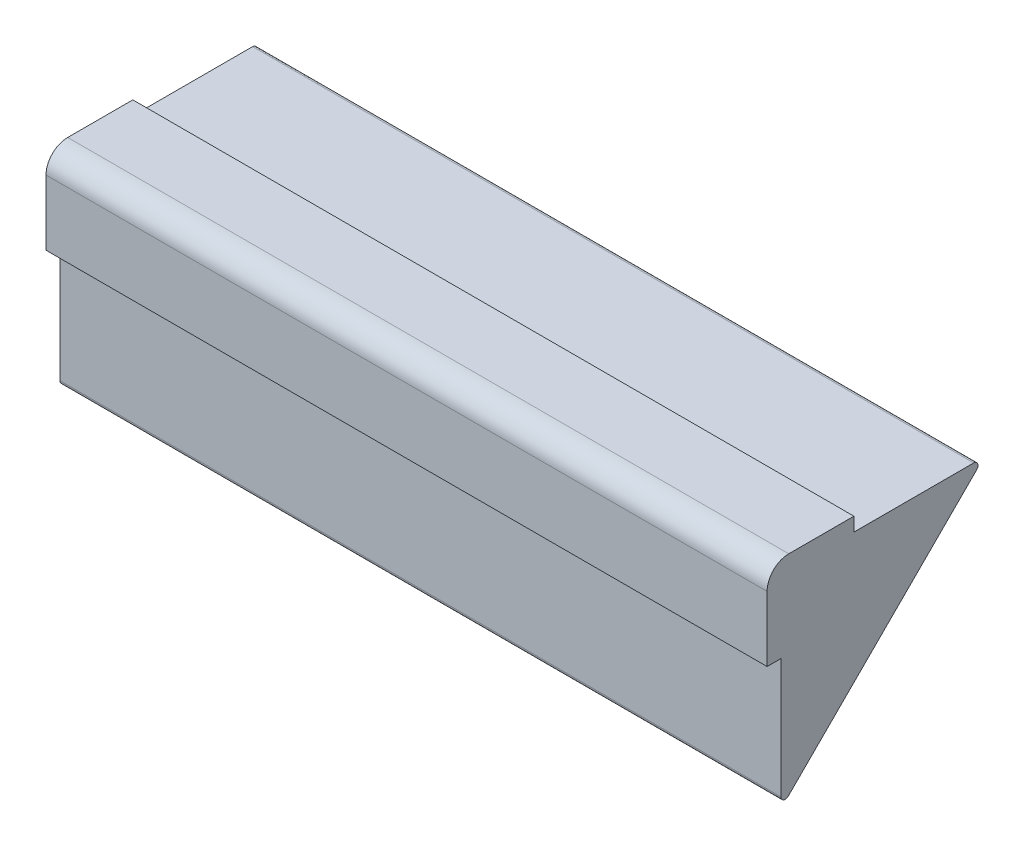
ISO-10303-21;
HEADER;
FILE_DESCRIPTION(('STEP AP214'),'2;1');
FILE_NAME('part.step','',(''),(''),'','','');
FILE_SCHEMA(('AUTOMOTIVE_DESIGN { 1 0 10303 214 1 1 1 1 }'));
ENDSEC;
DATA;
#1=APPLICATION_CONTEXT('core data for automotive mechanical design processes');
#2=APPLICATION_PROTOCOL_DEFINITION('international standard','automotive_design',2000,#1);
#3=PRODUCT_CONTEXT('',#1,'mechanical');
#4=PRODUCT('Part','Part','',(#3));
#5=PRODUCT_RELATED_PRODUCT_CATEGORY('part','',(#4));
#6=PRODUCT_DEFINITION_FORMATION('','',#4);
#7=PRODUCT_DEFINITION_CONTEXT('part definition',#1,'design');
#8=PRODUCT_DEFINITION('design','',#6,#7);
#9=PRODUCT_DEFINITION_SHAPE('','',#8);
#10=(LENGTH_UNIT() NAMED_UNIT(*) SI_UNIT(.MILLI.,.METRE.));
#11=(NAMED_UNIT(*) PLANE_ANGLE_UNIT() SI_UNIT($,.RADIAN.));
#12=(NAMED_UNIT(*) SI_UNIT($,.STERADIAN.) SOLID_ANGLE_UNIT());
#13=UNCERTAINTY_MEASURE_WITH_UNIT(LENGTH_MEASURE(1.E-05),#10,'distance_accuracy_value','');
#14=(GEOMETRIC_REPRESENTATION_CONTEXT(3) GLOBAL_UNCERTAINTY_ASSIGNED_CONTEXT((#13)) GLOBAL_UNIT_ASSIGNED_CONTEXT((#10,
#11,#12)) REPRESENTATION_CONTEXT('',''));
#15=CARTESIAN_POINT('',(0.,0.,0.));
#16=DIRECTION('',(0.,0.,1.));
#17=DIRECTION('',(1.,0.,0.));
#18=AXIS2_PLACEMENT_3D('',#15,#16,#17);
#19=CARTESIAN_POINT('',(166.124,-5.,-5.));
#20=DIRECTION('',(-1.,0.,0.));
#21=DIRECTION('',(0.,0.,1.));
#22=AXIS2_PLACEMENT_3D('',#19,#20,#21);
#23=CYLINDRICAL_SURFACE('',#22,5.);
#24=CARTESIAN_POINT('',(0.,-5.,-5.));
#25=DIRECTION('',(-1.,0.,0.));
#26=DIRECTION('',(0.,0.,1.));
#27=AXIS2_PLACEMENT_3D('',#24,#25,#26);
#28=CIRCLE('',#27,5.);
#29=CARTESIAN_POINT('',(0.,-5.00000000000004,0.));
#30=VERTEX_POINT('',#29);
#31=CARTESIAN_POINT('',(0.,0.,-5.00000000000004));
#32=VERTEX_POINT('',#31);
#33=EDGE_CURVE('E145',#30,#32,#28,.T.);
#34=ORIENTED_EDGE('',*,*,#33,.F.);
#35=DIRECTION('',(-1.,0.,0.));
#36=VECTOR('',#35,1.);
#37=CARTESIAN_POINT('',(166.124,-5.00000000000004,0.));
#38=LINE('',#37,#36);
#39=CARTESIAN_POINT('',(166.124,-5.00000000000004,0.));
#40=VERTEX_POINT('',#39);
#41=EDGE_CURVE('E11',#40,#30,#38,.T.);
#42=ORIENTED_EDGE('',*,*,#41,.F.);
#43=CARTESIAN_POINT('',(166.124,-5.,-5.));
#44=DIRECTION('',(-1.,0.,0.));
#45=DIRECTION('',(0.,0.,1.));
#46=AXIS2_PLACEMENT_3D('',#43,#44,#45);
#47=CIRCLE('',#46,5.);
#48=CARTESIAN_POINT('',(166.124,0.,-5.00000000000004));
#49=VERTEX_POINT('',#48);
#50=EDGE_CURVE('E171',#40,#49,#47,.T.);
#51=ORIENTED_EDGE('',*,*,#50,.T.);
#52=DIRECTION('',(-1.,0.,0.));
#53=VECTOR('',#52,1.);
#54=CARTESIAN_POINT('',(166.124,0.,-5.00000000000004));
#55=LINE('',#54,#53);
#56=EDGE_CURVE('E39',#49,#32,#55,.T.);
#57=ORIENTED_EDGE('',*,*,#56,.T.);
#58=EDGE_LOOP('',(#34,#42,#51,#57));
#59=FACE_BOUND('',#58,.T.);
#60=ADVANCED_FACE('F36',(#59),#23,.T.);
#61=CARTESIAN_POINT('',(166.124,-20.,0.));
#62=DIRECTION('',(0.,0.,1.));
#63=DIRECTION('',(0.,-1.,0.));
#64=AXIS2_PLACEMENT_3D('',#61,#62,#63);
#65=PLANE('',#64);
#66=DIRECTION('',(0.,1.,0.));
#67=VECTOR('',#66,1.);
#68=CARTESIAN_POINT('',(0.,-20.,0.));
#69=LINE('',#68,#67);
#70=CARTESIAN_POINT('',(0.,-20.,0.));
#71=VERTEX_POINT('',#70);
#72=EDGE_CURVE('E169',#71,#30,#69,.T.);
#73=ORIENTED_EDGE('',*,*,#72,.F.);
#74=DIRECTION('',(-1.,0.,0.));
#75=VECTOR('',#74,1.);
#76=CARTESIAN_POINT('',(166.124,-20.,0.));
#77=LINE('',#76,#75);
#78=CARTESIAN_POINT('',(166.124,-20.,0.));
#79=VERTEX_POINT('',#78);
#80=EDGE_CURVE('E45',#79,#71,#77,.T.);
#81=ORIENTED_EDGE('',*,*,#80,.F.);
#82=DIRECTION('',(0.,1.,0.));
#83=VECTOR('',#82,1.);
#84=CARTESIAN_POINT('',(166.124,-20.,0.));
#85=LINE('',#84,#83);
#86=EDGE_CURVE('E135',#79,#40,#85,.T.);
#87=ORIENTED_EDGE('',*,*,#86,.T.);
#88=ORIENTED_EDGE('',*,*,#41,.T.);
#89=EDGE_LOOP('',(#73,#81,#87,#88));
#90=FACE_BOUND('',#89,.T.);
#91=ADVANCED_FACE('F187',(#90),#65,.T.);
#92=CARTESIAN_POINT('',(166.124,-20.,-3.175));
#93=DIRECTION('',(0.,-1.,0.));
#94=DIRECTION('',(0.,0.,-1.));
#95=AXIS2_PLACEMENT_3D('',#92,#93,#94);
#96=PLANE('',#95);
#97=DIRECTION('',(0.,0.,1.));
#98=VECTOR('',#97,1.);
#99=CARTESIAN_POINT('',(0.,-20.,-3.175));
#100=LINE('',#99,#98);
#101=CARTESIAN_POINT('',(0.,-20.,-3.175));
#102=VERTEX_POINT('',#101);
#103=EDGE_CURVE('E122',#102,#71,#100,.T.);
#104=ORIENTED_EDGE('',*,*,#103,.F.);
#105=DIRECTION('',(-1.,0.,0.));
#106=VECTOR('',#105,1.);
#107=CARTESIAN_POINT('',(166.124,-20.,-3.175));
#108=LINE('',#107,#106);
#109=CARTESIAN_POINT('',(166.124,-20.,-3.175));
#110=VERTEX_POINT('',#109);
#111=EDGE_CURVE('E117',#110,#102,#108,.T.);
#112=ORIENTED_EDGE('',*,*,#111,.F.);
#113=DIRECTION('',(0.,0.,1.));
#114=VECTOR('',#113,1.);
#115=CARTESIAN_POINT('',(166.124,-20.,-3.175));
#116=LINE('',#115,#114);
#117=EDGE_CURVE('E120',#110,#79,#116,.T.);
#118=ORIENTED_EDGE('',*,*,#117,.T.);
#119=ORIENTED_EDGE('',*,*,#80,.T.);
#120=EDGE_LOOP('',(#104,#112,#118,#119));
#121=FACE_BOUND('',#120,.T.);
#122=ADVANCED_FACE('F119',(#121),#96,.T.);
#123=CARTESIAN_POINT('',(166.124,-47.5857864376269,-3.17500000000001));
#124=DIRECTION('',(0.,0.,1.));
#125=DIRECTION('',(0.,-1.,0.));
#126=AXIS2_PLACEMENT_3D('',#123,#124,#125);
#127=PLANE('',#126);
#128=DIRECTION('',(0.,1.,0.));
#129=VECTOR('',#128,1.);
#130=CARTESIAN_POINT('',(0.,-47.5857864376269,-3.17500000000001));
#131=LINE('',#130,#129);
#132=CARTESIAN_POINT('',(0.,-47.5857864376269,-3.17500000000001));
#133=VERTEX_POINT('',#132);
#134=EDGE_CURVE('E166',#133,#102,#131,.T.);
#135=ORIENTED_EDGE('',*,*,#134,.F.);
#136=DIRECTION('',(-1.,0.,0.));
#137=VECTOR('',#136,1.);
#138=CARTESIAN_POINT('',(166.124,-47.5857864376269,-3.17500000000001));
#139=LINE('',#138,#137);
#140=CARTESIAN_POINT('',(166.124,-47.5857864376269,-3.17500000000001));
#141=VERTEX_POINT('',#140);
#142=EDGE_CURVE('E127',#141,#133,#139,.T.);
#143=ORIENTED_EDGE('',*,*,#142,.F.);
#144=DIRECTION('',(0.,1.,0.));
#145=VECTOR('',#144,1.);
#146=CARTESIAN_POINT('',(166.124,-47.5857864376269,-3.17500000000001));
#147=LINE('',#146,#145);
#148=EDGE_CURVE('E133',#141,#110,#147,.T.);
#149=ORIENTED_EDGE('',*,*,#148,.T.);
#150=ORIENTED_EDGE('',*,*,#111,.T.);
#151=EDGE_LOOP('',(#135,#143,#149,#150));
#152=FACE_BOUND('',#151,.T.);
#153=ADVANCED_FACE('F137',(#152),#127,.T.);
#154=CARTESIAN_POINT('',(166.124,-47.5857864376269,-4.17500000000001));
#155=DIRECTION('',(-1.,0.,0.));
#156=DIRECTION('',(0.,0.,1.));
#157=AXIS2_PLACEMENT_3D('',#154,#155,#156);
#158=CYLINDRICAL_SURFACE('',#157,1.);
#159=CARTESIAN_POINT('',(0.,-47.5857864376269,-4.17500000000001));
#160=DIRECTION('',(-1.,0.,0.));
#161=DIRECTION('',(0.,0.,1.));
#162=AXIS2_PLACEMENT_3D('',#159,#160,#161);
#163=CIRCLE('',#162,1.);
#164=CARTESIAN_POINT('',(0.,-48.2928932188134,-4.88210678118657));
#165=VERTEX_POINT('',#164);
#166=EDGE_CURVE('E163',#165,#133,#163,.T.);
#167=ORIENTED_EDGE('',*,*,#166,.F.);
#168=DIRECTION('',(-1.,0.,0.));
#169=VECTOR('',#168,1.);
#170=CARTESIAN_POINT('',(166.124,-48.2928932188134,-4.88210678118657));
#171=LINE('',#170,#169);
#172=CARTESIAN_POINT('',(166.124,-48.2928932188134,-4.88210678118657));
#173=VERTEX_POINT('',#172);
#174=EDGE_CURVE('E175',#173,#165,#171,.T.);
#175=ORIENTED_EDGE('',*,*,#174,.F.);
#176=CARTESIAN_POINT('',(166.124,-47.5857864376269,-4.17500000000001));
#177=DIRECTION('',(-1.,0.,0.));
#178=DIRECTION('',(0.,0.,1.));
#179=AXIS2_PLACEMENT_3D('',#176,#177,#178);
#180=CIRCLE('',#179,1.);
#181=EDGE_CURVE('E138',#173,#141,#180,.T.);
#182=ORIENTED_EDGE('',*,*,#181,.T.);
#183=ORIENTED_EDGE('',*,*,#142,.T.);
#184=EDGE_LOOP('',(#167,#175,#182,#183));
#185=FACE_BOUND('',#184,.T.);
#186=ADVANCED_FACE('F200',(#185),#158,.T.);
#187=CARTESIAN_POINT('',(166.124,-4.88210678118656,-48.2928932188134));
#188=DIRECTION('',(0.,-0.707106781186547,-0.707106781186548));
#189=DIRECTION('',(0.,0.707106781186548,-0.707106781186547));
#190=AXIS2_PLACEMENT_3D('',#187,#188,#189);
#191=PLANE('',#190);
#192=DIRECTION('',(0.,-0.707106781186548,0.707106781186547));
#193=VECTOR('',#192,1.);
#194=CARTESIAN_POINT('',(0.,-4.88210678118656,-48.2928932188134));
#195=LINE('',#194,#193);
#196=CARTESIAN_POINT('',(0.,-4.88210678118656,-48.2928932188134));
#197=VERTEX_POINT('',#196);
#198=EDGE_CURVE('E160',#197,#165,#195,.T.);
#199=ORIENTED_EDGE('',*,*,#198,.F.);
#200=DIRECTION('',(-1.,0.,0.));
#201=VECTOR('',#200,1.);
#202=CARTESIAN_POINT('',(166.124,-4.88210678118656,-48.2928932188134));
#203=LINE('',#202,#201);
#204=CARTESIAN_POINT('',(166.124,-4.88210678118656,-48.2928932188134));
#205=VERTEX_POINT('',#204);
#206=EDGE_CURVE('E177',#205,#197,#203,.T.);
#207=ORIENTED_EDGE('',*,*,#206,.F.);
#208=DIRECTION('',(0.,-0.707106781186548,0.707106781186547));
#209=VECTOR('',#208,1.);
#210=CARTESIAN_POINT('',(166.124,-4.88210678118656,-48.2928932188134));
#211=LINE('',#210,#209);
#212=EDGE_CURVE('E140',#205,#173,#211,.T.);
#213=ORIENTED_EDGE('',*,*,#212,.T.);
#214=ORIENTED_EDGE('',*,*,#174,.T.);
#215=EDGE_LOOP('',(#199,#207,#213,#214));
#216=FACE_BOUND('',#215,.T.);
#217=ADVANCED_FACE('F203',(#216),#191,.T.);
#218=CARTESIAN_POINT('',(166.124,-4.175,-47.5857864376269));
#219=DIRECTION('',(-1.,0.,0.));
#220=DIRECTION('',(0.,0.,1.));
#221=AXIS2_PLACEMENT_3D('',#218,#219,#220);
#222=CYLINDRICAL_SURFACE('',#221,1.);
#223=CARTESIAN_POINT('',(0.,-4.175,-47.5857864376269));
#224=DIRECTION('',(-1.,0.,0.));
#225=DIRECTION('',(0.,0.,1.));
#226=AXIS2_PLACEMENT_3D('',#223,#224,#225);
#227=CIRCLE('',#226,1.);
#228=CARTESIAN_POINT('',(0.,-3.175,-47.5857864376269));
#229=VERTEX_POINT('',#228);
#230=EDGE_CURVE('E157',#229,#197,#227,.T.);
#231=ORIENTED_EDGE('',*,*,#230,.F.);
#232=DIRECTION('',(-1.,0.,0.));
#233=VECTOR('',#232,1.);
#234=CARTESIAN_POINT('',(166.124,-3.175,-47.5857864376269));
#235=LINE('',#234,#233);
#236=CARTESIAN_POINT('',(166.124,-3.175,-47.5857864376269));
#237=VERTEX_POINT('',#236);
#238=EDGE_CURVE('E179',#237,#229,#235,.T.);
#239=ORIENTED_EDGE('',*,*,#238,.F.);
#240=CARTESIAN_POINT('',(166.124,-4.175,-47.5857864376269));
#241=DIRECTION('',(-1.,0.,0.));
#242=DIRECTION('',(0.,0.,1.));
#243=AXIS2_PLACEMENT_3D('',#240,#241,#242);
#244=CIRCLE('',#243,1.);
#245=EDGE_CURVE('E302',#237,#205,#244,.T.);
#246=ORIENTED_EDGE('',*,*,#245,.T.);
#247=ORIENTED_EDGE('',*,*,#206,.T.);
#248=EDGE_LOOP('',(#231,#239,#246,#247));
#249=FACE_BOUND('',#248,.T.);
#250=ADVANCED_FACE('F207',(#249),#222,.T.);
#251=CARTESIAN_POINT('',(166.124,-3.175,-20.));
#252=DIRECTION('',(0.,1.,0.));
#253=DIRECTION('',(0.,0.,1.));
#254=AXIS2_PLACEMENT_3D('',#251,#252,#253);
#255=PLANE('',#254);
#256=DIRECTION('',(0.,0.,-1.));
#257=VECTOR('',#256,1.);
#258=CARTESIAN_POINT('',(0.,-3.175,-20.));
#259=LINE('',#258,#257);
#260=CARTESIAN_POINT('',(0.,-3.175,-20.));
#261=VERTEX_POINT('',#260);
#262=EDGE_CURVE('E154',#261,#229,#259,.T.);
#263=ORIENTED_EDGE('',*,*,#262,.F.);
#264=DIRECTION('',(-1.,0.,0.));
#265=VECTOR('',#264,1.);
#266=CARTESIAN_POINT('',(166.124,-3.175,-20.));
#267=LINE('',#266,#265);
#268=CARTESIAN_POINT('',(166.124,-3.175,-20.));
#269=VERTEX_POINT('',#268);
#270=EDGE_CURVE('E181',#269,#261,#267,.T.);
#271=ORIENTED_EDGE('',*,*,#270,.F.);
#272=DIRECTION('',(0.,0.,-1.));
#273=VECTOR('',#272,1.);
#274=CARTESIAN_POINT('',(166.124,-3.175,-20.));
#275=LINE('',#274,#273);
#276=EDGE_CURVE('E298',#269,#237,#275,.T.);
#277=ORIENTED_EDGE('',*,*,#276,.T.);
#278=ORIENTED_EDGE('',*,*,#238,.T.);
#279=EDGE_LOOP('',(#263,#271,#277,#278));
#280=FACE_BOUND('',#279,.T.);
#281=ADVANCED_FACE('F211',(#280),#255,.T.);
#282=CARTESIAN_POINT('',(166.124,0.,-20.));
#283=DIRECTION('',(0.,0.,-1.));
#284=DIRECTION('',(0.,1.,0.));
#285=AXIS2_PLACEMENT_3D('',#282,#283,#284);
#286=PLANE('',#285);
#287=DIRECTION('',(0.,-1.,0.));
#288=VECTOR('',#287,1.);
#289=CARTESIAN_POINT('',(0.,0.,-20.));
#290=LINE('',#289,#288);
#291=CARTESIAN_POINT('',(0.,0.,-20.));
#292=VERTEX_POINT('',#291);
#293=EDGE_CURVE('E151',#292,#261,#290,.T.);
#294=ORIENTED_EDGE('',*,*,#293,.F.);
#295=DIRECTION('',(-1.,0.,0.));
#296=VECTOR('',#295,1.);
#297=CARTESIAN_POINT('',(166.124,0.,-20.));
#298=LINE('',#297,#296);
#299=CARTESIAN_POINT('',(166.124,0.,-20.));
#300=VERTEX_POINT('',#299);
#301=EDGE_CURVE('E182',#300,#292,#298,.T.);
#302=ORIENTED_EDGE('',*,*,#301,.F.);
#303=DIRECTION('',(0.,-1.,0.));
#304=VECTOR('',#303,1.);
#305=CARTESIAN_POINT('',(166.124,0.,-20.));
#306=LINE('',#305,#304);
#307=EDGE_CURVE('E309',#300,#269,#306,.T.);
#308=ORIENTED_EDGE('',*,*,#307,.T.);
#309=ORIENTED_EDGE('',*,*,#270,.T.);
#310=EDGE_LOOP('',(#294,#302,#308,#309));
#311=FACE_BOUND('',#310,.T.);
#312=ADVANCED_FACE('F215',(#311),#286,.T.);
#313=CARTESIAN_POINT('',(166.124,0.,-5.00000000000004));
#314=DIRECTION('',(0.,1.,0.));
#315=DIRECTION('',(0.,0.,1.));
#316=AXIS2_PLACEMENT_3D('',#313,#314,#315);
#317=PLANE('',#316);
#318=DIRECTION('',(0.,0.,-1.));
#319=VECTOR('',#318,1.);
#320=CARTESIAN_POINT('',(0.,0.,-5.00000000000004));
#321=LINE('',#320,#319);
#322=EDGE_CURVE('E148',#32,#292,#321,.T.);
#323=ORIENTED_EDGE('',*,*,#322,.F.);
#324=ORIENTED_EDGE('',*,*,#56,.F.);
#325=DIRECTION('',(0.,0.,-1.));
#326=VECTOR('',#325,1.);
#327=CARTESIAN_POINT('',(166.124,0.,-5.00000000000004));
#328=LINE('',#327,#326);
#329=EDGE_CURVE('E311',#49,#300,#328,.T.);
#330=ORIENTED_EDGE('',*,*,#329,.T.);
#331=ORIENTED_EDGE('',*,*,#301,.T.);
#332=EDGE_LOOP('',(#323,#324,#330,#331));
#333=FACE_BOUND('',#332,.T.);
#334=ADVANCED_FACE('F184',(#333),#317,.T.);
#335=CARTESIAN_POINT('',(166.124,-5.,-5.));
#336=DIRECTION('',(-1.,0.,0.));
#337=DIRECTION('',(0.,0.,1.));
#338=AXIS2_PLACEMENT_3D('',#335,#336,#337);
#339=PLANE('',#338);
#340=ORIENTED_EDGE('',*,*,#50,.F.);
#341=ORIENTED_EDGE('',*,*,#86,.F.);
#342=ORIENTED_EDGE('',*,*,#117,.F.);
#343=ORIENTED_EDGE('',*,*,#148,.F.);
#344=ORIENTED_EDGE('',*,*,#181,.F.);
#345=ORIENTED_EDGE('',*,*,#212,.F.);
#346=ORIENTED_EDGE('',*,*,#245,.F.);
#347=ORIENTED_EDGE('',*,*,#276,.F.);
#348=ORIENTED_EDGE('',*,*,#307,.F.);
#349=ORIENTED_EDGE('',*,*,#329,.F.);
#350=EDGE_LOOP('',(#340,#341,#342,#343,#344,#345,#346,#347,#348,#349));
#351=FACE_BOUND('',#350,.T.);
#352=ADVANCED_FACE('F131',(#351),#339,.F.);
#353=CARTESIAN_POINT('',(0.,-5.,-5.));
#354=DIRECTION('',(-1.,0.,0.));
#355=DIRECTION('',(0.,0.,1.));
#356=AXIS2_PLACEMENT_3D('',#353,#354,#355);
#357=PLANE('',#356);
#358=ORIENTED_EDGE('',*,*,#33,.T.);
#359=ORIENTED_EDGE('',*,*,#322,.T.);
#360=ORIENTED_EDGE('',*,*,#293,.T.);
#361=ORIENTED_EDGE('',*,*,#262,.T.);
#362=ORIENTED_EDGE('',*,*,#230,.T.);
#363=ORIENTED_EDGE('',*,*,#198,.T.);
#364=ORIENTED_EDGE('',*,*,#166,.T.);
#365=ORIENTED_EDGE('',*,*,#134,.T.);
#366=ORIENTED_EDGE('',*,*,#103,.T.);
#367=ORIENTED_EDGE('',*,*,#72,.T.);
#368=EDGE_LOOP('',(#358,#359,#360,#361,#362,#363,#364,#365,#366,#367));
#369=FACE_BOUND('',#368,.T.);
#370=ADVANCED_FACE('F186',(#369),#357,.T.);
#371=CLOSED_SHELL('',(#60,#91,#122,#153,#186,#217,#250,#281,#312,#334,#352,#370));
#372=MANIFOLD_SOLID_BREP('B2',#371);
#373=ADVANCED_BREP_SHAPE_REPRESENTATION('',(#18,#372),#14);
#374=SHAPE_DEFINITION_REPRESENTATION(#9,#373);
ENDSEC;
END-ISO-10303-21;
